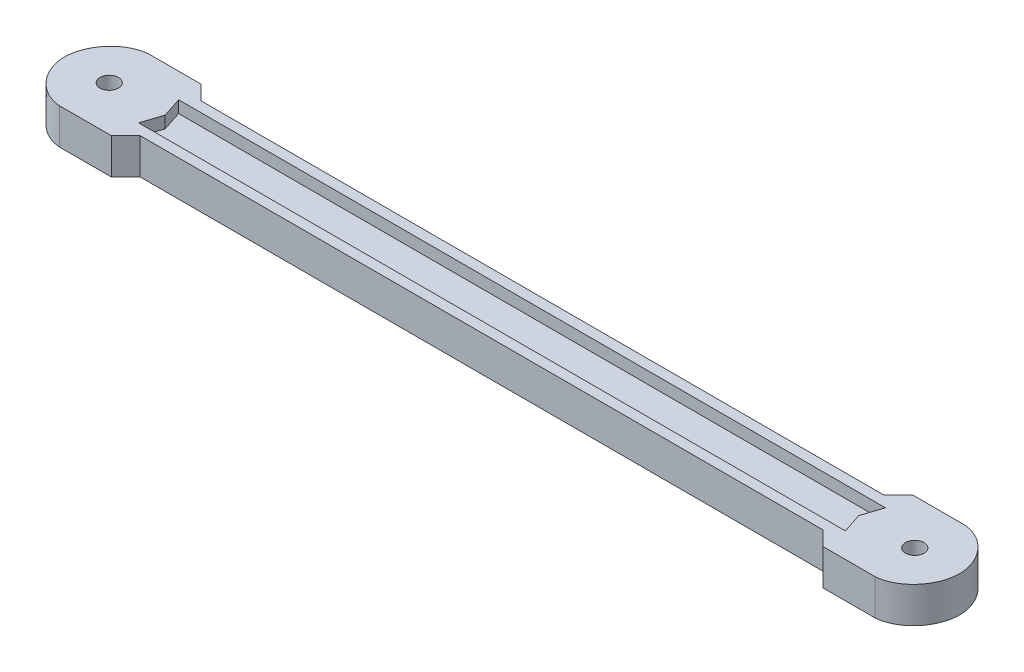
ISO-10303-21;
HEADER;
FILE_DESCRIPTION(('STEP AP214'),'2;1');
FILE_NAME('part.step','',(''),(''),'','','');
FILE_SCHEMA(('AUTOMOTIVE_DESIGN { 1 0 10303 214 1 1 1 1 }'));
ENDSEC;
DATA;
#1=APPLICATION_CONTEXT('core data for automotive mechanical design processes');
#2=APPLICATION_PROTOCOL_DEFINITION('international standard','automotive_design',2000,#1);
#3=PRODUCT_CONTEXT('',#1,'mechanical');
#4=PRODUCT('Part','Part','',(#3));
#5=PRODUCT_RELATED_PRODUCT_CATEGORY('part','',(#4));
#6=PRODUCT_DEFINITION_FORMATION('','',#4);
#7=PRODUCT_DEFINITION_CONTEXT('part definition',#1,'design');
#8=PRODUCT_DEFINITION('design','',#6,#7);
#9=PRODUCT_DEFINITION_SHAPE('','',#8);
#10=(LENGTH_UNIT() NAMED_UNIT(*) SI_UNIT(.MILLI.,.METRE.));
#11=(NAMED_UNIT(*) PLANE_ANGLE_UNIT() SI_UNIT($,.RADIAN.));
#12=(NAMED_UNIT(*) SI_UNIT($,.STERADIAN.) SOLID_ANGLE_UNIT());
#13=UNCERTAINTY_MEASURE_WITH_UNIT(LENGTH_MEASURE(1.E-05),#10,'distance_accuracy_value','');
#14=(GEOMETRIC_REPRESENTATION_CONTEXT(3) GLOBAL_UNCERTAINTY_ASSIGNED_CONTEXT((#13)) GLOBAL_UNIT_ASSIGNED_CONTEXT((#10,
#11,#12)) REPRESENTATION_CONTEXT('',''));
#15=CARTESIAN_POINT('',(0.,0.,0.));
#16=DIRECTION('',(0.,0.,1.));
#17=DIRECTION('',(1.,0.,0.));
#18=AXIS2_PLACEMENT_3D('',#15,#16,#17);
#19=CARTESIAN_POINT('',(-75.,6.,-7.5));
#20=DIRECTION('',(0.,0.,1.));
#21=DIRECTION('',(1.,0.,0.));
#22=AXIS2_PLACEMENT_3D('',#19,#20,#21);
#23=PLANE('',#22);
#24=DIRECTION('',(0.,1.,0.));
#25=VECTOR('',#24,1.);
#26=CARTESIAN_POINT('',(68.3154783819914,-6.,-7.50000000000003));
#27=LINE('',#26,#25);
#28=CARTESIAN_POINT('',(68.3154783819915,0.,-7.50000000000002));
#29=VERTEX_POINT('',#28);
#30=CARTESIAN_POINT('',(68.3154783819915,6.,-7.50000000000002));
#31=VERTEX_POINT('',#30);
#32=EDGE_CURVE('E268',#29,#31,#27,.T.);
#33=ORIENTED_EDGE('',*,*,#32,.F.);
#34=DIRECTION('',(-1.,0.,0.));
#35=VECTOR('',#34,1.);
#36=CARTESIAN_POINT('',(-75.,0.,-7.5));
#37=LINE('',#36,#35);
#38=CARTESIAN_POINT('',(59.6591580722005,0.,-7.50000000000002));
#39=VERTEX_POINT('',#38);
#40=EDGE_CURVE('E271',#29,#39,#37,.T.);
#41=ORIENTED_EDGE('',*,*,#40,.T.);
#42=DIRECTION('',(0.,1.,0.));
#43=VECTOR('',#42,1.);
#44=CARTESIAN_POINT('',(59.6591580722005,-6.,-7.50000000000003));
#45=LINE('',#44,#43);
#46=CARTESIAN_POINT('',(59.6591580722005,6.,-7.50000000000003));
#47=VERTEX_POINT('',#46);
#48=EDGE_CURVE('E334',#39,#47,#45,.T.);
#49=ORIENTED_EDGE('',*,*,#48,.T.);
#50=DIRECTION('',(-1.,0.,0.));
#51=VECTOR('',#50,1.);
#52=CARTESIAN_POINT('',(-75.,6.,-7.5));
#53=LINE('',#52,#51);
#54=EDGE_CURVE('E273',#31,#47,#53,.T.);
#55=ORIENTED_EDGE('',*,*,#54,.F.);
#56=EDGE_LOOP('',(#33,#41,#49,#55));
#57=FACE_BOUND('',#56,.T.);
#58=ADVANCED_FACE('F32',(#57),#23,.F.);
#59=DIRECTION('',(0.,1.,0.));
#60=VECTOR('',#59,1.);
#61=CARTESIAN_POINT('',(-68.3154783819918,-6.,-7.5));
#62=LINE('',#61,#60);
#63=CARTESIAN_POINT('',(-68.3154783819919,6.,-7.49999999999999));
#64=VERTEX_POINT('',#63);
#65=CARTESIAN_POINT('',(-68.3154783819919,0.,-7.5));
#66=VERTEX_POINT('',#65);
#67=EDGE_CURVE('E350',#64,#66,#62,.F.);
#68=ORIENTED_EDGE('',*,*,#67,.F.);
#69=CARTESIAN_POINT('',(-59.6591580722005,6.,-7.50000000000003));
#70=VERTEX_POINT('',#69);
#71=EDGE_CURVE('E353',#70,#64,#53,.T.);
#72=ORIENTED_EDGE('',*,*,#71,.F.);
#73=DIRECTION('',(0.,1.,0.));
#74=VECTOR('',#73,1.);
#75=CARTESIAN_POINT('',(-59.6591580722005,-6.,-7.50000000000003));
#76=LINE('',#75,#74);
#77=CARTESIAN_POINT('',(-59.6591580722005,0.,-7.50000000000003));
#78=VERTEX_POINT('',#77);
#79=EDGE_CURVE('E330',#78,#70,#76,.T.);
#80=ORIENTED_EDGE('',*,*,#79,.F.);
#81=EDGE_CURVE('E54',#78,#66,#37,.T.);
#82=ORIENTED_EDGE('',*,*,#81,.T.);
#83=EDGE_LOOP('',(#68,#72,#80,#82));
#84=FACE_BOUND('',#83,.T.);
#85=ADVANCED_FACE('F254',(#84),#23,.F.);
#86=CARTESIAN_POINT('',(-75.,6.,7.5));
#87=DIRECTION('',(0.,0.,-1.));
#88=DIRECTION('',(-1.,0.,0.));
#89=AXIS2_PLACEMENT_3D('',#86,#87,#88);
#90=PLANE('',#89);
#91=DIRECTION('',(1.,0.,0.));
#92=VECTOR('',#91,1.);
#93=CARTESIAN_POINT('',(-75.,0.,7.5));
#94=LINE('',#93,#92);
#95=CARTESIAN_POINT('',(59.6591580722005,0.,7.50000000000003));
#96=VERTEX_POINT('',#95);
#97=CARTESIAN_POINT('',(68.3154783799445,0.,7.50000000000003));
#98=VERTEX_POINT('',#97);
#99=EDGE_CURVE('E285',#96,#98,#94,.T.);
#100=ORIENTED_EDGE('',*,*,#99,.T.);
#101=DIRECTION('',(0.,1.,0.));
#102=VECTOR('',#101,1.);
#103=CARTESIAN_POINT('',(68.3154783799444,-6.,7.50000000000003));
#104=LINE('',#103,#102);
#105=CARTESIAN_POINT('',(68.3154783799445,6.,7.50000000000002));
#106=VERTEX_POINT('',#105);
#107=EDGE_CURVE('E276',#106,#98,#104,.F.);
#108=ORIENTED_EDGE('',*,*,#107,.F.);
#109=DIRECTION('',(1.,0.,0.));
#110=VECTOR('',#109,1.);
#111=CARTESIAN_POINT('',(-75.,6.,7.5));
#112=LINE('',#111,#110);
#113=CARTESIAN_POINT('',(59.6591580722005,6.,7.50000000000003));
#114=VERTEX_POINT('',#113);
#115=EDGE_CURVE('E290',#114,#106,#112,.T.);
#116=ORIENTED_EDGE('',*,*,#115,.F.);
#117=DIRECTION('',(0.,1.,0.));
#118=VECTOR('',#117,1.);
#119=CARTESIAN_POINT('',(59.6591580722005,-6.,7.50000000000003));
#120=LINE('',#119,#118);
#121=EDGE_CURVE('E339',#96,#114,#120,.T.);
#122=ORIENTED_EDGE('',*,*,#121,.F.);
#123=EDGE_LOOP('',(#100,#108,#116,#122));
#124=FACE_BOUND('',#123,.T.);
#125=ADVANCED_FACE('F252',(#124),#90,.F.);
#126=DIRECTION('',(0.,1.,0.));
#127=VECTOR('',#126,1.);
#128=CARTESIAN_POINT('',(-68.3154783799448,-6.,7.5));
#129=LINE('',#128,#127);
#130=CARTESIAN_POINT('',(-68.3154783799449,0.,7.49999999999999));
#131=VERTEX_POINT('',#130);
#132=CARTESIAN_POINT('',(-68.3154783799449,6.,7.5));
#133=VERTEX_POINT('',#132);
#134=EDGE_CURVE('E332',#131,#133,#129,.T.);
#135=ORIENTED_EDGE('',*,*,#134,.F.);
#136=CARTESIAN_POINT('',(-59.6591580722005,0.,7.5));
#137=VERTEX_POINT('',#136);
#138=EDGE_CURVE('E287',#131,#137,#94,.T.);
#139=ORIENTED_EDGE('',*,*,#138,.T.);
#140=DIRECTION('',(0.,1.,0.));
#141=VECTOR('',#140,1.);
#142=CARTESIAN_POINT('',(-59.6591580722005,-6.,7.50000000000003));
#143=LINE('',#142,#141);
#144=CARTESIAN_POINT('',(-59.6591580722005,6.,7.50000000000003));
#145=VERTEX_POINT('',#144);
#146=EDGE_CURVE('E345',#137,#145,#143,.T.);
#147=ORIENTED_EDGE('',*,*,#146,.T.);
#148=EDGE_CURVE('E299',#133,#145,#112,.T.);
#149=ORIENTED_EDGE('',*,*,#148,.F.);
#150=EDGE_LOOP('',(#135,#139,#147,#149));
#151=FACE_BOUND('',#150,.T.);
#152=ADVANCED_FACE('F248',(#151),#90,.F.);
#153=CARTESIAN_POINT('',(0.,6.,0.));
#154=DIRECTION('',(0.,-1.,0.));
#155=DIRECTION('',(0.,0.,-1.));
#156=AXIS2_PLACEMENT_3D('',#153,#154,#155);
#157=PLANE('',#156);
#158=DIRECTION('',(1.,0.,0.));
#159=VECTOR('',#158,1.);
#160=CARTESIAN_POINT('',(-59.2174150880341,6.,3.35193649705162));
#161=LINE('',#160,#159);
#162=CARTESIAN_POINT('',(-59.2174150880341,6.,3.35193649705162));
#163=VERTEX_POINT('',#162);
#164=CARTESIAN_POINT('',(59.2174150880341,6.,3.35193649705162));
#165=VERTEX_POINT('',#164);
#166=EDGE_CURVE('E193',#163,#165,#161,.T.);
#167=ORIENTED_EDGE('',*,*,#166,.F.);
#168=DIRECTION('',(-0.309876944964647,0.,0.950776671453069));
#169=VECTOR('',#168,1.);
#170=CARTESIAN_POINT('',(-58.1249526069823,6.,0.));
#171=LINE('',#170,#169);
#172=CARTESIAN_POINT('',(-58.1249526069823,6.,0.));
#173=VERTEX_POINT('',#172);
#174=EDGE_CURVE('E46',#173,#163,#171,.T.);
#175=ORIENTED_EDGE('',*,*,#174,.F.);
#176=DIRECTION('',(0.309876944964647,0.,0.950776671453069));
#177=VECTOR('',#176,1.);
#178=CARTESIAN_POINT('',(-58.1249526069823,6.,0.));
#179=LINE('',#178,#177);
#180=CARTESIAN_POINT('',(-59.2174150880341,6.,-3.35193649705162));
#181=VERTEX_POINT('',#180);
#182=EDGE_CURVE('E179',#181,#173,#179,.T.);
#183=ORIENTED_EDGE('',*,*,#182,.F.);
#184=DIRECTION('',(-1.,0.,0.));
#185=VECTOR('',#184,1.);
#186=CARTESIAN_POINT('',(-59.2174150880341,6.,-3.35193649705162));
#187=LINE('',#186,#185);
#188=CARTESIAN_POINT('',(59.2174150880341,6.,-3.35193649705162));
#189=VERTEX_POINT('',#188);
#190=EDGE_CURVE('E182',#189,#181,#187,.T.);
#191=ORIENTED_EDGE('',*,*,#190,.F.);
#192=DIRECTION('',(0.309876944964647,0.,-0.950776671453069));
#193=VECTOR('',#192,1.);
#194=CARTESIAN_POINT('',(58.1249526069823,6.,0.));
#195=LINE('',#194,#193);
#196=CARTESIAN_POINT('',(58.1249526069823,6.,0.));
#197=VERTEX_POINT('',#196);
#198=EDGE_CURVE('E198',#197,#189,#195,.T.);
#199=ORIENTED_EDGE('',*,*,#198,.F.);
#200=DIRECTION('',(-0.309876944964647,0.,-0.950776671453069));
#201=VECTOR('',#200,1.);
#202=CARTESIAN_POINT('',(58.1249526069823,6.,0.));
#203=LINE('',#202,#201);
#204=EDGE_CURVE('E195',#165,#197,#203,.T.);
#205=ORIENTED_EDGE('',*,*,#204,.F.);
#206=EDGE_LOOP('',(#167,#175,#183,#191,#199,#205));
#207=FACE_BOUND('',#206,.T.);
#208=CARTESIAN_POINT('',(-67.5,6.,0.));
#209=DIRECTION('',(0.,-1.,0.));
#210=DIRECTION('',(0.,0.,-1.));
#211=AXIS2_PLACEMENT_3D('',#208,#209,#210);
#212=CIRCLE('',#211,1.54999999999999);
#213=CARTESIAN_POINT('',(-67.5,6.,-1.54999999999999));
#214=VERTEX_POINT('',#213);
#215=EDGE_CURVE('E221',#214,#214,#212,.T.);
#216=ORIENTED_EDGE('',*,*,#215,.T.);
#217=EDGE_LOOP('',(#216));
#218=FACE_BOUND('',#217,.T.);
#219=CARTESIAN_POINT('',(67.5,6.,0.));
#220=DIRECTION('',(0.,-1.,0.));
#221=DIRECTION('',(0.,0.,-1.));
#222=AXIS2_PLACEMENT_3D('',#219,#220,#221);
#223=CIRCLE('',#222,1.54999999999999);
#224=CARTESIAN_POINT('',(67.5,6.,-1.54999999999999));
#225=VERTEX_POINT('',#224);
#226=EDGE_CURVE('E216',#225,#225,#223,.T.);
#227=ORIENTED_EDGE('',*,*,#226,.T.);
#228=EDGE_LOOP('',(#227));
#229=FACE_BOUND('',#228,.T.);
#230=DIRECTION('',(-0.707106781186552,0.,-0.707106781186543));
#231=VECTOR('',#230,1.);
#232=CARTESIAN_POINT('',(-59.6591580722005,6.,-7.50000000000003));
#233=LINE('',#232,#231);
#234=CARTESIAN_POINT('',(-57.2385162336034,6.,-5.07935816140295));
#235=VERTEX_POINT('',#234);
#236=EDGE_CURVE('E328',#235,#70,#233,.T.);
#237=ORIENTED_EDGE('',*,*,#236,.T.);
#238=ORIENTED_EDGE('',*,*,#71,.T.);
#239=CARTESIAN_POINT('',(-67.5,6.,-7.50000000000003));
#240=CARTESIAN_POINT('',(-71.5851812404319,6.,-7.77395705413381));
#241=CARTESIAN_POINT('',(-78.4148187585371,6.,8.00609463461444E-10));
#242=CARTESIAN_POINT('',(-71.5851812424938,6.,7.77395705319478));
#243=CARTESIAN_POINT('',(-67.5,6.,7.50000000000002));
#244=B_SPLINE_CURVE_WITH_KNOTS('',3,(#239,#240,#241,#242,#243),.UNSPECIFIED.,.F.,.F.,(4,1,4),
(0.,0.499999999989352,1.),.UNSPECIFIED.);
#245=EDGE_CURVE('E224',#64,#133,#244,.T.);
#246=ORIENTED_EDGE('',*,*,#245,.T.);
#247=ORIENTED_EDGE('',*,*,#148,.T.);
#248=DIRECTION('',(0.707106781186552,0.,-0.707106781186543));
#249=VECTOR('',#248,1.);
#250=CARTESIAN_POINT('',(-59.6591580722005,6.,7.50000000000003));
#251=LINE('',#250,#249);
#252=CARTESIAN_POINT('',(-57.2385162336034,6.,5.07935816140295));
#253=VERTEX_POINT('',#252);
#254=EDGE_CURVE('E365',#145,#253,#251,.T.);
#255=ORIENTED_EDGE('',*,*,#254,.T.);
#256=DIRECTION('',(1.,0.,0.));
#257=VECTOR('',#256,1.);
#258=CARTESIAN_POINT('',(-57.2385162336034,6.,5.07935816140295));
#259=LINE('',#258,#257);
#260=CARTESIAN_POINT('',(57.2385162336034,6.,5.07935816140295));
#261=VERTEX_POINT('',#260);
#262=EDGE_CURVE('E379',#253,#261,#259,.T.);
#263=ORIENTED_EDGE('',*,*,#262,.T.);
#264=DIRECTION('',(0.707106781186552,0.,0.707106781186543));
#265=VECTOR('',#264,1.);
#266=CARTESIAN_POINT('',(59.6591580722005,6.,7.50000000000003));
#267=LINE('',#266,#265);
#268=EDGE_CURVE('E375',#261,#114,#267,.T.);
#269=ORIENTED_EDGE('',*,*,#268,.T.);
#270=ORIENTED_EDGE('',*,*,#115,.T.);
#271=CARTESIAN_POINT('',(67.5,6.,7.50000000000002));
#272=CARTESIAN_POINT('',(71.5851812424938,6.,7.77395705319478));
#273=CARTESIAN_POINT('',(78.4148187585371,6.,8.00610190752763E-10));
#274=CARTESIAN_POINT('',(71.5851812404319,6.,-7.77395705413381));
#275=CARTESIAN_POINT('',(67.5,6.,-7.50000000000003));
#276=B_SPLINE_CURVE_WITH_KNOTS('',3,(#271,#272,#273,#274,#275),.UNSPECIFIED.,.F.,.F.,(4,1,4),
(0.,0.500000000010647,1.),.UNSPECIFIED.);
#277=EDGE_CURVE('E378',#106,#31,#276,.T.);
#278=ORIENTED_EDGE('',*,*,#277,.T.);
#279=ORIENTED_EDGE('',*,*,#54,.T.);
#280=DIRECTION('',(-0.707106781186552,0.,0.707106781186543));
#281=VECTOR('',#280,1.);
#282=CARTESIAN_POINT('',(59.6591580722005,6.,-7.50000000000003));
#283=LINE('',#282,#281);
#284=CARTESIAN_POINT('',(57.2385162336034,6.,-5.07935816140295));
#285=VERTEX_POINT('',#284);
#286=EDGE_CURVE('E387',#47,#285,#283,.T.);
#287=ORIENTED_EDGE('',*,*,#286,.T.);
#288=DIRECTION('',(-1.,0.,0.));
#289=VECTOR('',#288,1.);
#290=CARTESIAN_POINT('',(-57.2385162336034,6.,-5.07935816140295));
#291=LINE('',#290,#289);
#292=EDGE_CURVE('E393',#285,#235,#291,.T.);
#293=ORIENTED_EDGE('',*,*,#292,.T.);
#294=EDGE_LOOP('',(#237,#238,#246,#247,#255,#263,#269,#270,#278,#279,#287,#293));
#295=FACE_BOUND('',#294,.T.);
#296=ADVANCED_FACE('F245',(#207,#218,#229,#295),#157,.F.);
#297=CARTESIAN_POINT('',(0.,0.,0.));
#298=DIRECTION('',(0.,-1.,0.));
#299=DIRECTION('',(0.,0.,-1.));
#300=AXIS2_PLACEMENT_3D('',#297,#298,#299);
#301=PLANE('',#300);
#302=CARTESIAN_POINT('',(-67.5,0.,0.));
#303=DIRECTION('',(0.,-1.,0.));
#304=DIRECTION('',(0.,0.,-1.));
#305=AXIS2_PLACEMENT_3D('',#302,#303,#304);
#306=CIRCLE('',#305,1.54999999999999);
#307=CARTESIAN_POINT('',(-67.5,0.,-1.54999999999999));
#308=VERTEX_POINT('',#307);
#309=EDGE_CURVE('E213',#308,#308,#306,.T.);
#310=ORIENTED_EDGE('',*,*,#309,.F.);
#311=EDGE_LOOP('',(#310));
#312=FACE_BOUND('',#311,.T.);
#313=CARTESIAN_POINT('',(67.5,0.,0.));
#314=DIRECTION('',(0.,-1.,0.));
#315=DIRECTION('',(0.,0.,1.));
#316=AXIS2_PLACEMENT_3D('',#313,#314,#315);
#317=CIRCLE('',#316,1.54999999999999);
#318=CARTESIAN_POINT('',(67.5,0.,1.54999999999999));
#319=VERTEX_POINT('',#318);
#320=EDGE_CURVE('E205',#319,#319,#317,.T.);
#321=ORIENTED_EDGE('',*,*,#320,.F.);
#322=EDGE_LOOP('',(#321));
#323=FACE_BOUND('',#322,.T.);
#324=ORIENTED_EDGE('',*,*,#81,.F.);
#325=DIRECTION('',(0.707106781186553,0.,0.707106781186543));
#326=VECTOR('',#325,1.);
#327=CARTESIAN_POINT('',(-26.0795790360998,0.,26.0795790361002));
#328=LINE('',#327,#326);
#329=CARTESIAN_POINT('',(-57.2385162336034,0.,-5.07935816140295));
#330=VERTEX_POINT('',#329);
#331=EDGE_CURVE('E11',#78,#330,#328,.T.);
#332=ORIENTED_EDGE('',*,*,#331,.T.);
#333=DIRECTION('',(1.,0.,0.));
#334=VECTOR('',#333,1.);
#335=CARTESIAN_POINT('',(0.,0.,-5.07935816140295));
#336=LINE('',#335,#334);
#337=CARTESIAN_POINT('',(57.2385162336034,0.,-5.07935816140295));
#338=VERTEX_POINT('',#337);
#339=EDGE_CURVE('E39',#330,#338,#336,.T.);
#340=ORIENTED_EDGE('',*,*,#339,.T.);
#341=DIRECTION('',(0.707106781186553,0.,-0.707106781186543));
#342=VECTOR('',#341,1.);
#343=CARTESIAN_POINT('',(26.0795790360998,0.,26.0795790361002));
#344=LINE('',#343,#342);
#345=EDGE_CURVE('E284',#338,#39,#344,.T.);
#346=ORIENTED_EDGE('',*,*,#345,.T.);
#347=ORIENTED_EDGE('',*,*,#40,.F.);
#348=CARTESIAN_POINT('',(67.5,0.,7.50000000000002));
#349=CARTESIAN_POINT('',(71.5851812424938,0.,7.77395705319478));
#350=CARTESIAN_POINT('',(78.4148187585371,0.,8.00610190752763E-10));
#351=CARTESIAN_POINT('',(71.5851812404319,0.,-7.77395705413381));
#352=CARTESIAN_POINT('',(67.5,0.,-7.50000000000003));
#353=B_SPLINE_CURVE_WITH_KNOTS('',3,(#348,#349,#350,#351,#352),.UNSPECIFIED.,.F.,.F.,(4,1,4),
(0.,0.500000000010647,1.),.UNSPECIFIED.);
#354=EDGE_CURVE('E282',#29,#98,#353,.F.);
#355=ORIENTED_EDGE('',*,*,#354,.T.);
#356=ORIENTED_EDGE('',*,*,#99,.F.);
#357=DIRECTION('',(-0.707106781186553,0.,-0.707106781186543));
#358=VECTOR('',#357,1.);
#359=CARTESIAN_POINT('',(26.0795790360998,0.,-26.0795790361002));
#360=LINE('',#359,#358);
#361=CARTESIAN_POINT('',(57.2385162336034,0.,5.07935816140295));
#362=VERTEX_POINT('',#361);
#363=EDGE_CURVE('E308',#96,#362,#360,.T.);
#364=ORIENTED_EDGE('',*,*,#363,.T.);
#365=DIRECTION('',(-1.,0.,0.));
#366=VECTOR('',#365,1.);
#367=CARTESIAN_POINT('',(0.,0.,5.07935816140295));
#368=LINE('',#367,#366);
#369=CARTESIAN_POINT('',(-57.2385162336034,0.,5.07935816140295));
#370=VERTEX_POINT('',#369);
#371=EDGE_CURVE('E305',#362,#370,#368,.T.);
#372=ORIENTED_EDGE('',*,*,#371,.T.);
#373=DIRECTION('',(-0.707106781186553,0.,0.707106781186543));
#374=VECTOR('',#373,1.);
#375=CARTESIAN_POINT('',(-26.0795790360998,0.,-26.0795790361002));
#376=LINE('',#375,#374);
#377=EDGE_CURVE('E298',#370,#137,#376,.T.);
#378=ORIENTED_EDGE('',*,*,#377,.T.);
#379=ORIENTED_EDGE('',*,*,#138,.F.);
#380=CARTESIAN_POINT('',(-67.5,0.,-7.50000000000003));
#381=CARTESIAN_POINT('',(-71.5851812404319,0.,-7.77395705413381));
#382=CARTESIAN_POINT('',(-78.4148187585371,0.,8.00609463461444E-10));
#383=CARTESIAN_POINT('',(-71.5851812424938,0.,7.77395705319478));
#384=CARTESIAN_POINT('',(-67.5,0.,7.50000000000002));
#385=B_SPLINE_CURVE_WITH_KNOTS('',3,(#380,#381,#382,#383,#384),.UNSPECIFIED.,.F.,.F.,(4,1,4),
(0.,0.499999999989352,1.),.UNSPECIFIED.);
#386=EDGE_CURVE('E293',#131,#66,#385,.F.);
#387=ORIENTED_EDGE('',*,*,#386,.T.);
#388=EDGE_LOOP('',(#324,#332,#340,#346,#347,#355,#356,#364,#372,#378,#379,#387));
#389=FACE_BOUND('',#388,.T.);
#390=ADVANCED_FACE('F242',(#312,#323,#389),#301,.T.);
#391=CARTESIAN_POINT('',(-67.5,-6.,-7.50000000000003));
#392=CARTESIAN_POINT('',(-71.5851812404319,-6.,-7.77395705413381));
#393=CARTESIAN_POINT('',(-78.4148187585371,-6.,8.00609463461444E-10));
#394=CARTESIAN_POINT('',(-71.5851812424938,-6.,7.77395705319478));
#395=CARTESIAN_POINT('',(-67.5,-6.,7.50000000000002));
#396=B_SPLINE_CURVE_WITH_KNOTS('',3,(#391,#392,#393,#394,#395),.UNSPECIFIED.,.F.,.F.,(4,1,4),
(0.,0.499999999989352,1.),.UNSPECIFIED.);
#397=DIRECTION('',(0.,1.,0.));
#398=VECTOR('',#397,1.);
#399=SURFACE_OF_LINEAR_EXTRUSION('',#396,#398);
#400=ORIENTED_EDGE('',*,*,#386,.F.);
#401=ORIENTED_EDGE('',*,*,#134,.T.);
#402=ORIENTED_EDGE('',*,*,#245,.F.);
#403=ORIENTED_EDGE('',*,*,#67,.T.);
#404=EDGE_LOOP('',(#400,#401,#402,#403));
#405=FACE_BOUND('',#404,.T.);
#406=ADVANCED_FACE('F237',(#405),#399,.T.);
#407=CARTESIAN_POINT('',(-59.6591580722005,-6.,7.50000000000003));
#408=DIRECTION('',(0.707106781186543,0.,0.707106781186553));
#409=DIRECTION('',(0.707106781186553,0.,-0.707106781186543));
#410=AXIS2_PLACEMENT_3D('',#407,#408,#409);
#411=PLANE('',#410);
#412=DIRECTION('',(0.,1.,0.));
#413=VECTOR('',#412,1.);
#414=CARTESIAN_POINT('',(-57.2385162336034,-6.,5.07935816140295));
#415=LINE('',#414,#413);
#416=EDGE_CURVE('E343',#370,#253,#415,.T.);
#417=ORIENTED_EDGE('',*,*,#416,.T.);
#418=ORIENTED_EDGE('',*,*,#254,.F.);
#419=ORIENTED_EDGE('',*,*,#146,.F.);
#420=ORIENTED_EDGE('',*,*,#377,.F.);
#421=EDGE_LOOP('',(#417,#418,#419,#420));
#422=FACE_BOUND('',#421,.T.);
#423=ADVANCED_FACE('F241',(#422),#411,.T.);
#424=CARTESIAN_POINT('',(-57.2385162336034,-6.,5.07935816140295));
#425=DIRECTION('',(0.,0.,1.));
#426=DIRECTION('',(1.,0.,0.));
#427=AXIS2_PLACEMENT_3D('',#424,#425,#426);
#428=PLANE('',#427);
#429=DIRECTION('',(0.,1.,0.));
#430=VECTOR('',#429,1.);
#431=CARTESIAN_POINT('',(57.2385162336034,-6.,5.07935816140295));
#432=LINE('',#431,#430);
#433=EDGE_CURVE('E341',#362,#261,#432,.T.);
#434=ORIENTED_EDGE('',*,*,#433,.T.);
#435=ORIENTED_EDGE('',*,*,#262,.F.);
#436=ORIENTED_EDGE('',*,*,#416,.F.);
#437=ORIENTED_EDGE('',*,*,#371,.F.);
#438=EDGE_LOOP('',(#434,#435,#436,#437));
#439=FACE_BOUND('',#438,.T.);
#440=ADVANCED_FACE('F368',(#439),#428,.T.);
#441=CARTESIAN_POINT('',(59.6591580722005,-6.,7.50000000000003));
#442=DIRECTION('',(-0.707106781186543,0.,0.707106781186553));
#443=DIRECTION('',(0.707106781186553,0.,0.707106781186543));
#444=AXIS2_PLACEMENT_3D('',#441,#442,#443);
#445=PLANE('',#444);
#446=ORIENTED_EDGE('',*,*,#121,.T.);
#447=ORIENTED_EDGE('',*,*,#268,.F.);
#448=ORIENTED_EDGE('',*,*,#433,.F.);
#449=ORIENTED_EDGE('',*,*,#363,.F.);
#450=EDGE_LOOP('',(#446,#447,#448,#449));
#451=FACE_BOUND('',#450,.T.);
#452=ADVANCED_FACE('F372',(#451),#445,.T.);
#453=CARTESIAN_POINT('',(67.5,-6.,7.50000000000002));
#454=CARTESIAN_POINT('',(71.5851812424938,-6.,7.77395705319478));
#455=CARTESIAN_POINT('',(78.4148187585371,-6.,8.00610190752763E-10));
#456=CARTESIAN_POINT('',(71.5851812404319,-6.,-7.77395705413381));
#457=CARTESIAN_POINT('',(67.5,-6.,-7.50000000000003));
#458=B_SPLINE_CURVE_WITH_KNOTS('',3,(#453,#454,#455,#456,#457),.UNSPECIFIED.,.F.,.F.,(4,1,4),
(0.,0.500000000010647,1.),.UNSPECIFIED.);
#459=DIRECTION('',(0.,1.,0.));
#460=VECTOR('',#459,1.);
#461=SURFACE_OF_LINEAR_EXTRUSION('',#458,#460);
#462=ORIENTED_EDGE('',*,*,#354,.F.);
#463=ORIENTED_EDGE('',*,*,#32,.T.);
#464=ORIENTED_EDGE('',*,*,#277,.F.);
#465=ORIENTED_EDGE('',*,*,#107,.T.);
#466=EDGE_LOOP('',(#462,#463,#464,#465));
#467=FACE_BOUND('',#466,.T.);
#468=ADVANCED_FACE('F400',(#467),#461,.T.);
#469=CARTESIAN_POINT('',(-59.6591580722005,-6.,-7.50000000000003));
#470=DIRECTION('',(0.707106781186543,0.,-0.707106781186553));
#471=DIRECTION('',(-0.707106781186553,0.,-0.707106781186543));
#472=AXIS2_PLACEMENT_3D('',#469,#470,#471);
#473=PLANE('',#472);
#474=ORIENTED_EDGE('',*,*,#79,.T.);
#475=ORIENTED_EDGE('',*,*,#236,.F.);
#476=DIRECTION('',(0.,1.,0.));
#477=VECTOR('',#476,1.);
#478=CARTESIAN_POINT('',(-57.2385162336034,-6.,-5.07935816140295));
#479=LINE('',#478,#477);
#480=EDGE_CURVE('E322',#330,#235,#479,.T.);
#481=ORIENTED_EDGE('',*,*,#480,.F.);
#482=ORIENTED_EDGE('',*,*,#331,.F.);
#483=EDGE_LOOP('',(#474,#475,#481,#482));
#484=FACE_BOUND('',#483,.T.);
#485=ADVANCED_FACE('F326',(#484),#473,.T.);
#486=CARTESIAN_POINT('',(-57.2385162336034,-6.,-5.07935816140295));
#487=DIRECTION('',(0.,0.,-1.));
#488=DIRECTION('',(-1.,0.,0.));
#489=AXIS2_PLACEMENT_3D('',#486,#487,#488);
#490=PLANE('',#489);
#491=ORIENTED_EDGE('',*,*,#480,.T.);
#492=ORIENTED_EDGE('',*,*,#292,.F.);
#493=DIRECTION('',(0.,1.,0.));
#494=VECTOR('',#493,1.);
#495=CARTESIAN_POINT('',(57.2385162336034,-6.,-5.07935816140295));
#496=LINE('',#495,#494);
#497=EDGE_CURVE('E324',#338,#285,#496,.T.);
#498=ORIENTED_EDGE('',*,*,#497,.F.);
#499=ORIENTED_EDGE('',*,*,#339,.F.);
#500=EDGE_LOOP('',(#491,#492,#498,#499));
#501=FACE_BOUND('',#500,.T.);
#502=ADVANCED_FACE('F320',(#501),#490,.T.);
#503=CARTESIAN_POINT('',(59.6591580722005,-6.,-7.50000000000003));
#504=DIRECTION('',(-0.707106781186543,0.,-0.707106781186553));
#505=DIRECTION('',(-0.707106781186553,0.,0.707106781186543));
#506=AXIS2_PLACEMENT_3D('',#503,#504,#505);
#507=PLANE('',#506);
#508=ORIENTED_EDGE('',*,*,#497,.T.);
#509=ORIENTED_EDGE('',*,*,#286,.F.);
#510=ORIENTED_EDGE('',*,*,#48,.F.);
#511=ORIENTED_EDGE('',*,*,#345,.F.);
#512=EDGE_LOOP('',(#508,#509,#510,#511));
#513=FACE_BOUND('',#512,.T.);
#514=ADVANCED_FACE('F410',(#513),#507,.T.);
#515=CARTESIAN_POINT('',(67.5,12.,0.));
#516=DIRECTION('',(0.,-1.,0.));
#517=DIRECTION('',(0.,0.,-1.));
#518=AXIS2_PLACEMENT_3D('',#515,#516,#517);
#519=CYLINDRICAL_SURFACE('',#518,1.54999999999999);
#520=ORIENTED_EDGE('',*,*,#320,.T.);
#521=EDGE_LOOP('',(#520));
#522=FACE_BOUND('',#521,.T.);
#523=ORIENTED_EDGE('',*,*,#226,.F.);
#524=EDGE_LOOP('',(#523));
#525=FACE_BOUND('',#524,.T.);
#526=ADVANCED_FACE('F489',(#522,#525),#519,.F.);
#527=CARTESIAN_POINT('',(-67.5,12.,0.));
#528=DIRECTION('',(0.,-1.,0.));
#529=DIRECTION('',(0.,0.,-1.));
#530=AXIS2_PLACEMENT_3D('',#527,#528,#529);
#531=CYLINDRICAL_SURFACE('',#530,1.54999999999999);
#532=ORIENTED_EDGE('',*,*,#309,.T.);
#533=EDGE_LOOP('',(#532));
#534=FACE_BOUND('',#533,.T.);
#535=ORIENTED_EDGE('',*,*,#215,.F.);
#536=EDGE_LOOP('',(#535));
#537=FACE_BOUND('',#536,.T.);
#538=ADVANCED_FACE('F496',(#534,#537),#531,.F.);
#539=CARTESIAN_POINT('',(-58.1249526069823,4.,0.));
#540=DIRECTION('',(-0.950776671453069,0.,-0.309876944964647));
#541=DIRECTION('',(-0.309876944964647,0.,0.950776671453069));
#542=AXIS2_PLACEMENT_3D('',#539,#540,#541);
#543=PLANE('',#542);
#544=ORIENTED_EDGE('',*,*,#174,.T.);
#545=DIRECTION('',(0.,1.,0.));
#546=VECTOR('',#545,1.);
#547=CARTESIAN_POINT('',(-59.2174150880341,4.,3.35193649705162));
#548=LINE('',#547,#546);
#549=CARTESIAN_POINT('',(-59.2174150880341,4.,3.35193649705162));
#550=VERTEX_POINT('',#549);
#551=EDGE_CURVE('E156',#550,#163,#548,.T.);
#552=ORIENTED_EDGE('',*,*,#551,.F.);
#553=DIRECTION('',(-0.309876944964647,0.,0.950776671453069));
#554=VECTOR('',#553,1.);
#555=CARTESIAN_POINT('',(-58.1249526069823,4.,0.));
#556=LINE('',#555,#554);
#557=CARTESIAN_POINT('',(-58.1249526069823,4.,0.));
#558=VERTEX_POINT('',#557);
#559=EDGE_CURVE('E160',#558,#550,#556,.T.);
#560=ORIENTED_EDGE('',*,*,#559,.F.);
#561=DIRECTION('',(0.,1.,0.));
#562=VECTOR('',#561,1.);
#563=CARTESIAN_POINT('',(-58.1249526069823,4.,0.));
#564=LINE('',#563,#562);
#565=EDGE_CURVE('E203',#558,#173,#564,.T.);
#566=ORIENTED_EDGE('',*,*,#565,.T.);
#567=EDGE_LOOP('',(#544,#552,#560,#566));
#568=FACE_BOUND('',#567,.T.);
#569=ADVANCED_FACE('F158',(#568),#543,.F.);
#570=CARTESIAN_POINT('',(-58.1249526069823,4.,0.));
#571=DIRECTION('',(-0.950776671453069,0.,0.309876944964647));
#572=DIRECTION('',(0.309876944964647,0.,0.950776671453069));
#573=AXIS2_PLACEMENT_3D('',#570,#571,#572);
#574=PLANE('',#573);
#575=ORIENTED_EDGE('',*,*,#182,.T.);
#576=ORIENTED_EDGE('',*,*,#565,.F.);
#577=DIRECTION('',(0.309876944964647,0.,0.950776671453069));
#578=VECTOR('',#577,1.);
#579=CARTESIAN_POINT('',(-58.1249526069823,4.,0.));
#580=LINE('',#579,#578);
#581=CARTESIAN_POINT('',(-59.2174150880341,4.,-3.35193649705162));
#582=VERTEX_POINT('',#581);
#583=EDGE_CURVE('E166',#582,#558,#580,.T.);
#584=ORIENTED_EDGE('',*,*,#583,.F.);
#585=DIRECTION('',(0.,1.,0.));
#586=VECTOR('',#585,1.);
#587=CARTESIAN_POINT('',(-59.2174150880341,4.,-3.35193649705162));
#588=LINE('',#587,#586);
#589=EDGE_CURVE('E206',#582,#181,#588,.T.);
#590=ORIENTED_EDGE('',*,*,#589,.T.);
#591=EDGE_LOOP('',(#575,#576,#584,#590));
#592=FACE_BOUND('',#591,.T.);
#593=ADVANCED_FACE('F511',(#592),#574,.F.);
#594=CARTESIAN_POINT('',(-59.2174150880341,4.,-3.35193649705162));
#595=DIRECTION('',(0.,0.,-1.));
#596=DIRECTION('',(-1.,0.,0.));
#597=AXIS2_PLACEMENT_3D('',#594,#595,#596);
#598=PLANE('',#597);
#599=ORIENTED_EDGE('',*,*,#190,.T.);
#600=ORIENTED_EDGE('',*,*,#589,.F.);
#601=DIRECTION('',(-1.,0.,0.));
#602=VECTOR('',#601,1.);
#603=CARTESIAN_POINT('',(-59.2174150880341,4.,-3.35193649705162));
#604=LINE('',#603,#602);
#605=CARTESIAN_POINT('',(59.2174150880341,4.,-3.35193649705162));
#606=VERTEX_POINT('',#605);
#607=EDGE_CURVE('E189',#606,#582,#604,.T.);
#608=ORIENTED_EDGE('',*,*,#607,.F.);
#609=DIRECTION('',(0.,1.,0.));
#610=VECTOR('',#609,1.);
#611=CARTESIAN_POINT('',(59.2174150880341,4.,-3.35193649705162));
#612=LINE('',#611,#610);
#613=EDGE_CURVE('E208',#606,#189,#612,.T.);
#614=ORIENTED_EDGE('',*,*,#613,.T.);
#615=EDGE_LOOP('',(#599,#600,#608,#614));
#616=FACE_BOUND('',#615,.T.);
#617=ADVANCED_FACE('F519',(#616),#598,.F.);
#618=CARTESIAN_POINT('',(58.1249526069823,4.,0.));
#619=DIRECTION('',(0.950776671453069,0.,0.309876944964647));
#620=DIRECTION('',(0.309876944964647,0.,-0.950776671453069));
#621=AXIS2_PLACEMENT_3D('',#618,#619,#620);
#622=PLANE('',#621);
#623=ORIENTED_EDGE('',*,*,#198,.T.);
#624=ORIENTED_EDGE('',*,*,#613,.F.);
#625=DIRECTION('',(0.309876944964647,0.,-0.950776671453069));
#626=VECTOR('',#625,1.);
#627=CARTESIAN_POINT('',(58.1249526069823,4.,0.));
#628=LINE('',#627,#626);
#629=CARTESIAN_POINT('',(58.1249526069823,4.,0.));
#630=VERTEX_POINT('',#629);
#631=EDGE_CURVE('E186',#630,#606,#628,.T.);
#632=ORIENTED_EDGE('',*,*,#631,.F.);
#633=DIRECTION('',(0.,1.,0.));
#634=VECTOR('',#633,1.);
#635=CARTESIAN_POINT('',(58.1249526069823,4.,0.));
#636=LINE('',#635,#634);
#637=EDGE_CURVE('E210',#630,#197,#636,.T.);
#638=ORIENTED_EDGE('',*,*,#637,.T.);
#639=EDGE_LOOP('',(#623,#624,#632,#638));
#640=FACE_BOUND('',#639,.T.);
#641=ADVANCED_FACE('F528',(#640),#622,.F.);
#642=CARTESIAN_POINT('',(58.1249526069823,4.,0.));
#643=DIRECTION('',(0.950776671453069,0.,-0.309876944964647));
#644=DIRECTION('',(-0.309876944964647,0.,-0.950776671453069));
#645=AXIS2_PLACEMENT_3D('',#642,#643,#644);
#646=PLANE('',#645);
#647=ORIENTED_EDGE('',*,*,#204,.T.);
#648=ORIENTED_EDGE('',*,*,#637,.F.);
#649=DIRECTION('',(-0.309876944964647,0.,-0.950776671453069));
#650=VECTOR('',#649,1.);
#651=CARTESIAN_POINT('',(58.1249526069823,4.,0.));
#652=LINE('',#651,#650);
#653=CARTESIAN_POINT('',(59.2174150880341,4.,3.35193649705162));
#654=VERTEX_POINT('',#653);
#655=EDGE_CURVE('E174',#654,#630,#652,.T.);
#656=ORIENTED_EDGE('',*,*,#655,.F.);
#657=DIRECTION('',(0.,1.,0.));
#658=VECTOR('',#657,1.);
#659=CARTESIAN_POINT('',(59.2174150880341,4.,3.35193649705162));
#660=LINE('',#659,#658);
#661=EDGE_CURVE('E165',#654,#165,#660,.T.);
#662=ORIENTED_EDGE('',*,*,#661,.T.);
#663=EDGE_LOOP('',(#647,#648,#656,#662));
#664=FACE_BOUND('',#663,.T.);
#665=ADVANCED_FACE('F537',(#664),#646,.F.);
#666=CARTESIAN_POINT('',(-59.2174150880341,4.,3.35193649705162));
#667=DIRECTION('',(0.,0.,1.));
#668=DIRECTION('',(1.,0.,0.));
#669=AXIS2_PLACEMENT_3D('',#666,#667,#668);
#670=PLANE('',#669);
#671=ORIENTED_EDGE('',*,*,#166,.T.);
#672=ORIENTED_EDGE('',*,*,#661,.F.);
#673=DIRECTION('',(1.,0.,0.));
#674=VECTOR('',#673,1.);
#675=CARTESIAN_POINT('',(-59.2174150880341,4.,3.35193649705162));
#676=LINE('',#675,#674);
#677=EDGE_CURVE('E169',#550,#654,#676,.T.);
#678=ORIENTED_EDGE('',*,*,#677,.F.);
#679=ORIENTED_EDGE('',*,*,#551,.T.);
#680=EDGE_LOOP('',(#671,#672,#678,#679));
#681=FACE_BOUND('',#680,.T.);
#682=ADVANCED_FACE('F170',(#681),#670,.F.);
#683=CARTESIAN_POINT('',(0.,4.,0.));
#684=DIRECTION('',(0.,1.,0.));
#685=DIRECTION('',(0.,0.,1.));
#686=AXIS2_PLACEMENT_3D('',#683,#684,#685);
#687=PLANE('',#686);
#688=ORIENTED_EDGE('',*,*,#559,.T.);
#689=ORIENTED_EDGE('',*,*,#677,.T.);
#690=ORIENTED_EDGE('',*,*,#655,.T.);
#691=ORIENTED_EDGE('',*,*,#631,.T.);
#692=ORIENTED_EDGE('',*,*,#607,.T.);
#693=ORIENTED_EDGE('',*,*,#583,.T.);
#694=EDGE_LOOP('',(#688,#689,#690,#691,#692,#693));
#695=FACE_BOUND('',#694,.T.);
#696=ADVANCED_FACE('F176',(#695),#687,.T.);
#697=CLOSED_SHELL('',(#58,#85,#125,#152,#296,#390,#406,#423,#440,#452,#468,#485,#502,#514,#526,
#538,#569,#593,#617,#641,#665,#682,#696));
#698=MANIFOLD_SOLID_BREP('B2',#697);
#699=ADVANCED_BREP_SHAPE_REPRESENTATION('',(#18,#698),#14);
#700=SHAPE_DEFINITION_REPRESENTATION(#9,#699);
ENDSEC;
END-ISO-10303-21;
